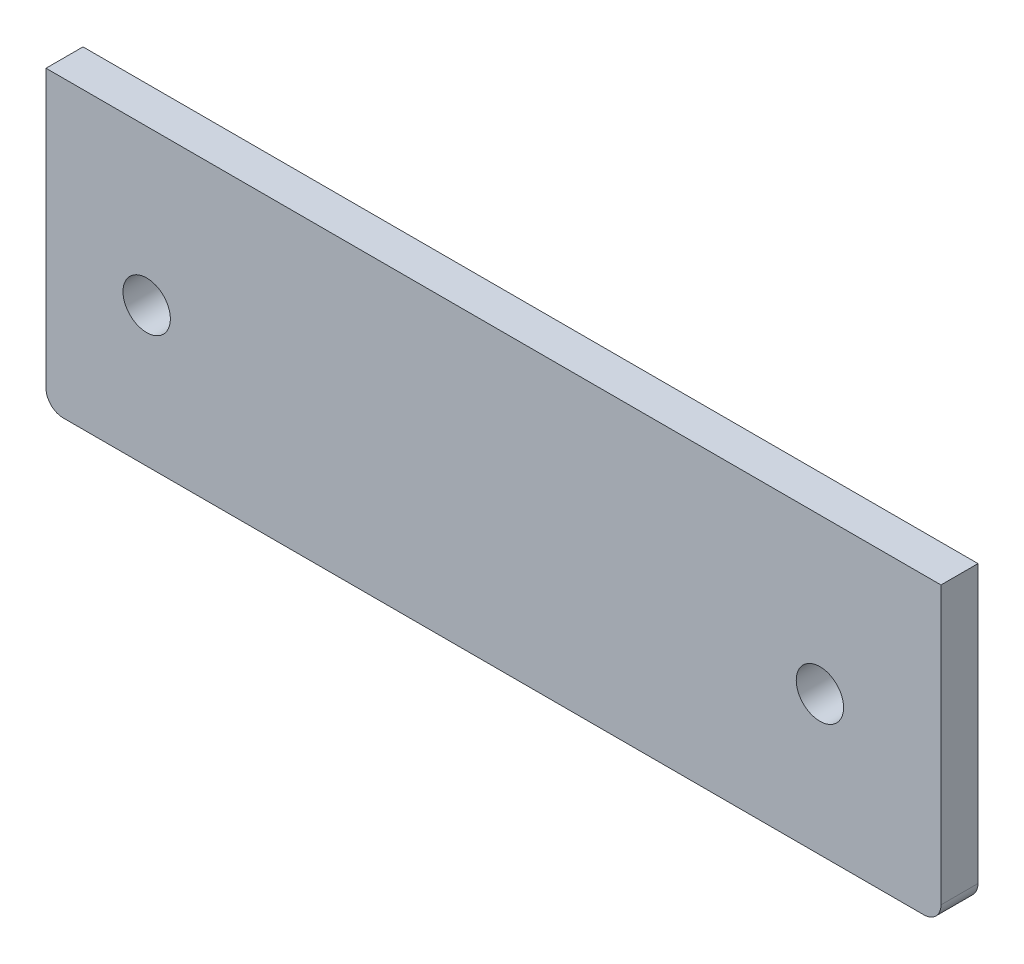
ISO-10303-21;
HEADER;
FILE_DESCRIPTION(('STEP AP214'),'2;1');
FILE_NAME('part.step','',(''),(''),'','','');
FILE_SCHEMA(('AUTOMOTIVE_DESIGN { 1 0 10303 214 1 1 1 1 }'));
ENDSEC;
DATA;
#1=APPLICATION_CONTEXT('core data for automotive mechanical design processes');
#2=APPLICATION_PROTOCOL_DEFINITION('international standard','automotive_design',2000,#1);
#3=PRODUCT_CONTEXT('',#1,'mechanical');
#4=PRODUCT('Part','Part','',(#3));
#5=PRODUCT_RELATED_PRODUCT_CATEGORY('part','',(#4));
#6=PRODUCT_DEFINITION_FORMATION('','',#4);
#7=PRODUCT_DEFINITION_CONTEXT('part definition',#1,'design');
#8=PRODUCT_DEFINITION('design','',#6,#7);
#9=PRODUCT_DEFINITION_SHAPE('','',#8);
#10=(LENGTH_UNIT() NAMED_UNIT(*) SI_UNIT(.MILLI.,.METRE.));
#11=(NAMED_UNIT(*) PLANE_ANGLE_UNIT() SI_UNIT($,.RADIAN.));
#12=(NAMED_UNIT(*) SI_UNIT($,.STERADIAN.) SOLID_ANGLE_UNIT());
#13=UNCERTAINTY_MEASURE_WITH_UNIT(LENGTH_MEASURE(1.E-05),#10,'distance_accuracy_value','');
#14=(GEOMETRIC_REPRESENTATION_CONTEXT(3) GLOBAL_UNCERTAINTY_ASSIGNED_CONTEXT((#13)) GLOBAL_UNIT_ASSIGNED_CONTEXT((#10,
#11,#12)) REPRESENTATION_CONTEXT('',''));
#15=CARTESIAN_POINT('',(0.,0.,0.));
#16=DIRECTION('',(0.,0.,1.));
#17=DIRECTION('',(1.,0.,0.));
#18=AXIS2_PLACEMENT_3D('',#15,#16,#17);
#19=CARTESIAN_POINT('',(0.,0.,23.6));
#20=DIRECTION('',(0.,0.,1.));
#21=DIRECTION('',(1.,0.,0.));
#22=AXIS2_PLACEMENT_3D('',#19,#20,#21);
#23=PLANE('',#22);
#24=CARTESIAN_POINT('',(-57.7823194312308,1.49846116090471,23.6));
#25=DIRECTION('',(0.,0.,1.));
#26=DIRECTION('',(1.,0.,0.));
#27=AXIS2_PLACEMENT_3D('',#24,#25,#26);
#28=CIRCLE('',#27,2.74999999999999);
#29=CARTESIAN_POINT('',(-60.5323194312308,1.49846116090471,23.6));
#30=VERTEX_POINT('',#29);
#31=EDGE_CURVE('E117',#30,#30,#28,.T.);
#32=ORIENTED_EDGE('',*,*,#31,.F.);
#33=EDGE_LOOP('',(#32));
#34=FACE_BOUND('',#33,.T.);
#35=DIRECTION('',(1.,0.,0.));
#36=VECTOR('',#35,1.);
#37=CARTESIAN_POINT('',(-69.4767741901678,-14.6898747964315,23.6));
#38=LINE('',#37,#36);
#39=CARTESIAN_POINT('',(-67.4767741901678,-14.6898747964315,23.6));
#40=VERTEX_POINT('',#39);
#41=CARTESIAN_POINT('',(32.4916365637999,-14.6898747964315,23.6));
#42=VERTEX_POINT('',#41);
#43=EDGE_CURVE('E96',#40,#42,#38,.T.);
#44=ORIENTED_EDGE('',*,*,#43,.T.);
#45=CARTESIAN_POINT('',(32.4916365637999,-12.6898747964315,23.6));
#46=DIRECTION('',(0.,0.,1.));
#47=DIRECTION('',(1.,0.,0.));
#48=AXIS2_PLACEMENT_3D('',#45,#46,#47);
#49=CIRCLE('',#48,2.);
#50=CARTESIAN_POINT('',(34.4916365637999,-12.6898747964315,23.6));
#51=VERTEX_POINT('',#50);
#52=EDGE_CURVE('E40',#42,#51,#49,.T.);
#53=ORIENTED_EDGE('',*,*,#52,.T.);
#54=DIRECTION('',(0.,1.,0.));
#55=VECTOR('',#54,1.);
#56=CARTESIAN_POINT('',(34.4916365637999,-14.6898747964315,23.6));
#57=LINE('',#56,#55);
#58=CARTESIAN_POINT('',(34.4916365637999,19.4961837580603,23.6));
#59=VERTEX_POINT('',#58);
#60=EDGE_CURVE('E86',#51,#59,#57,.T.);
#61=ORIENTED_EDGE('',*,*,#60,.T.);
#62=DIRECTION('',(-1.,0.,0.));
#63=VECTOR('',#62,1.);
#64=CARTESIAN_POINT('',(34.4916365637999,19.4961837580603,23.6));
#65=LINE('',#64,#63);
#66=CARTESIAN_POINT('',(-69.4767741901678,19.4961837580603,23.6));
#67=VERTEX_POINT('',#66);
#68=EDGE_CURVE('E90',#59,#67,#65,.T.);
#69=ORIENTED_EDGE('',*,*,#68,.T.);
#70=DIRECTION('',(0.,-1.,0.));
#71=VECTOR('',#70,1.);
#72=CARTESIAN_POINT('',(-69.4767741901678,19.4961837580603,23.6));
#73=LINE('',#72,#71);
#74=CARTESIAN_POINT('',(-69.4767741901678,-12.6898747964315,23.6));
#75=VERTEX_POINT('',#74);
#76=EDGE_CURVE('E121',#67,#75,#73,.T.);
#77=ORIENTED_EDGE('',*,*,#76,.T.);
#78=CARTESIAN_POINT('',(-67.4767741901678,-12.6898747964315,23.6));
#79=DIRECTION('',(0.,0.,1.));
#80=DIRECTION('',(1.,0.,0.));
#81=AXIS2_PLACEMENT_3D('',#78,#79,#80);
#82=CIRCLE('',#81,2.);
#83=EDGE_CURVE('E132',#75,#40,#82,.T.);
#84=ORIENTED_EDGE('',*,*,#83,.T.);
#85=EDGE_LOOP('',(#44,#53,#61,#69,#77,#84));
#86=FACE_BOUND('',#85,.T.);
#87=CARTESIAN_POINT('',(20.4264892959067,1.49846116090477,23.6));
#88=DIRECTION('',(0.,0.,1.));
#89=DIRECTION('',(1.,0.,0.));
#90=AXIS2_PLACEMENT_3D('',#87,#88,#89);
#91=CIRCLE('',#90,2.74999999999999);
#92=CARTESIAN_POINT('',(17.6764892959067,1.49846116090477,23.6));
#93=VERTEX_POINT('',#92);
#94=EDGE_CURVE('E148',#93,#93,#91,.T.);
#95=ORIENTED_EDGE('',*,*,#94,.F.);
#96=EDGE_LOOP('',(#95));
#97=FACE_BOUND('',#96,.T.);
#98=ADVANCED_FACE('F32',(#34,#86,#97),#23,.T.);
#99=CARTESIAN_POINT('',(0.,0.,19.3));
#100=DIRECTION('',(0.,0.,1.));
#101=DIRECTION('',(1.,0.,0.));
#102=AXIS2_PLACEMENT_3D('',#99,#100,#101);
#103=PLANE('',#102);
#104=DIRECTION('',(0.,1.,0.));
#105=VECTOR('',#104,1.);
#106=CARTESIAN_POINT('',(34.4916365637999,-14.6898747964315,19.3));
#107=LINE('',#106,#105);
#108=CARTESIAN_POINT('',(34.4916365637999,-12.6898747964315,19.3));
#109=VERTEX_POINT('',#108);
#110=CARTESIAN_POINT('',(34.4916365637999,19.4961837580603,19.3));
#111=VERTEX_POINT('',#110);
#112=EDGE_CURVE('E102',#109,#111,#107,.T.);
#113=ORIENTED_EDGE('',*,*,#112,.F.);
#114=CARTESIAN_POINT('',(32.4916365637999,-12.6898747964315,19.3));
#115=DIRECTION('',(0.,0.,1.));
#116=DIRECTION('',(1.,0.,0.));
#117=AXIS2_PLACEMENT_3D('',#114,#115,#116);
#118=CIRCLE('',#117,2.);
#119=CARTESIAN_POINT('',(32.4916365637999,-14.6898747964315,19.3));
#120=VERTEX_POINT('',#119);
#121=EDGE_CURVE('E126',#109,#120,#118,.F.);
#122=ORIENTED_EDGE('',*,*,#121,.T.);
#123=DIRECTION('',(1.,0.,0.));
#124=VECTOR('',#123,1.);
#125=CARTESIAN_POINT('',(-69.4767741901678,-14.6898747964315,19.3));
#126=LINE('',#125,#124);
#127=CARTESIAN_POINT('',(-67.4767741901678,-14.6898747964315,19.3));
#128=VERTEX_POINT('',#127);
#129=EDGE_CURVE('E116',#128,#120,#126,.T.);
#130=ORIENTED_EDGE('',*,*,#129,.F.);
#131=CARTESIAN_POINT('',(-67.4767741901678,-12.6898747964315,19.3));
#132=DIRECTION('',(0.,0.,1.));
#133=DIRECTION('',(1.,0.,0.));
#134=AXIS2_PLACEMENT_3D('',#131,#132,#133);
#135=CIRCLE('',#134,2.);
#136=CARTESIAN_POINT('',(-69.4767741901678,-12.6898747964315,19.3));
#137=VERTEX_POINT('',#136);
#138=EDGE_CURVE('E124',#128,#137,#135,.F.);
#139=ORIENTED_EDGE('',*,*,#138,.T.);
#140=DIRECTION('',(0.,-1.,0.));
#141=VECTOR('',#140,1.);
#142=CARTESIAN_POINT('',(-69.4767741901678,19.4961837580603,19.3));
#143=LINE('',#142,#141);
#144=CARTESIAN_POINT('',(-69.4767741901678,19.4961837580603,19.3));
#145=VERTEX_POINT('',#144);
#146=EDGE_CURVE('E114',#145,#137,#143,.T.);
#147=ORIENTED_EDGE('',*,*,#146,.F.);
#148=DIRECTION('',(-1.,0.,0.));
#149=VECTOR('',#148,1.);
#150=CARTESIAN_POINT('',(34.4916365637999,19.4961837580603,19.3));
#151=LINE('',#150,#149);
#152=EDGE_CURVE('E120',#111,#145,#151,.T.);
#153=ORIENTED_EDGE('',*,*,#152,.F.);
#154=EDGE_LOOP('',(#113,#122,#130,#139,#147,#153));
#155=FACE_BOUND('',#154,.T.);
#156=CARTESIAN_POINT('',(-57.7823194312308,1.49846116090471,19.3));
#157=DIRECTION('',(0.,0.,1.));
#158=DIRECTION('',(1.,0.,0.));
#159=AXIS2_PLACEMENT_3D('',#156,#157,#158);
#160=CIRCLE('',#159,2.74999999999999);
#161=CARTESIAN_POINT('',(-60.5323194312308,1.49846116090471,19.3));
#162=VERTEX_POINT('',#161);
#163=EDGE_CURVE('E145',#162,#162,#160,.T.);
#164=ORIENTED_EDGE('',*,*,#163,.T.);
#165=EDGE_LOOP('',(#164));
#166=FACE_BOUND('',#165,.T.);
#167=CARTESIAN_POINT('',(20.4264892959067,1.49846116090477,19.3));
#168=DIRECTION('',(0.,0.,1.));
#169=DIRECTION('',(1.,0.,0.));
#170=AXIS2_PLACEMENT_3D('',#167,#168,#169);
#171=CIRCLE('',#170,2.74999999999999);
#172=CARTESIAN_POINT('',(17.6764892959067,1.49846116090477,19.3));
#173=VERTEX_POINT('',#172);
#174=EDGE_CURVE('E151',#173,#173,#171,.T.);
#175=ORIENTED_EDGE('',*,*,#174,.T.);
#176=EDGE_LOOP('',(#175));
#177=FACE_BOUND('',#176,.T.);
#178=ADVANCED_FACE('F140',(#155,#166,#177),#103,.F.);
#179=CARTESIAN_POINT('',(-69.4767741901678,19.4961837580603,23.6));
#180=DIRECTION('',(1.,0.,0.));
#181=DIRECTION('',(0.,0.,-1.));
#182=AXIS2_PLACEMENT_3D('',#179,#180,#181);
#183=PLANE('',#182);
#184=ORIENTED_EDGE('',*,*,#146,.T.);
#185=DIRECTION('',(0.,0.,-1.));
#186=VECTOR('',#185,1.);
#187=CARTESIAN_POINT('',(-69.4767741901678,-12.6898747964315,23.6));
#188=LINE('',#187,#186);
#189=EDGE_CURVE('E11',#137,#75,#188,.F.);
#190=ORIENTED_EDGE('',*,*,#189,.T.);
#191=ORIENTED_EDGE('',*,*,#76,.F.);
#192=DIRECTION('',(0.,0.,-1.));
#193=VECTOR('',#192,1.);
#194=CARTESIAN_POINT('',(-69.4767741901678,19.4961837580603,23.6));
#195=LINE('',#194,#193);
#196=EDGE_CURVE('E106',#67,#145,#195,.T.);
#197=ORIENTED_EDGE('',*,*,#196,.T.);
#198=EDGE_LOOP('',(#184,#190,#191,#197));
#199=FACE_BOUND('',#198,.T.);
#200=ADVANCED_FACE('F142',(#199),#183,.F.);
#201=CARTESIAN_POINT('',(-69.4767741901678,-14.6898747964315,23.6));
#202=DIRECTION('',(0.,1.,0.));
#203=DIRECTION('',(0.,0.,1.));
#204=AXIS2_PLACEMENT_3D('',#201,#202,#203);
#205=PLANE('',#204);
#206=ORIENTED_EDGE('',*,*,#129,.T.);
#207=DIRECTION('',(0.,0.,-1.));
#208=VECTOR('',#207,1.);
#209=CARTESIAN_POINT('',(32.4916365637999,-14.6898747964315,23.6));
#210=LINE('',#209,#208);
#211=EDGE_CURVE('E53',#120,#42,#210,.F.);
#212=ORIENTED_EDGE('',*,*,#211,.T.);
#213=ORIENTED_EDGE('',*,*,#43,.F.);
#214=DIRECTION('',(0.,0.,-1.));
#215=VECTOR('',#214,1.);
#216=CARTESIAN_POINT('',(-67.4767741901678,-14.6898747964315,23.6));
#217=LINE('',#216,#215);
#218=EDGE_CURVE('E128',#40,#128,#217,.T.);
#219=ORIENTED_EDGE('',*,*,#218,.T.);
#220=EDGE_LOOP('',(#206,#212,#213,#219));
#221=FACE_BOUND('',#220,.T.);
#222=ADVANCED_FACE('F136',(#221),#205,.F.);
#223=CARTESIAN_POINT('',(34.4916365637999,-14.6898747964315,23.6));
#224=DIRECTION('',(-1.,0.,0.));
#225=DIRECTION('',(0.,0.,1.));
#226=AXIS2_PLACEMENT_3D('',#223,#224,#225);
#227=PLANE('',#226);
#228=ORIENTED_EDGE('',*,*,#60,.F.);
#229=DIRECTION('',(0.,0.,-1.));
#230=VECTOR('',#229,1.);
#231=CARTESIAN_POINT('',(34.4916365637999,-12.6898747964315,23.6));
#232=LINE('',#231,#230);
#233=EDGE_CURVE('E105',#51,#109,#232,.T.);
#234=ORIENTED_EDGE('',*,*,#233,.T.);
#235=ORIENTED_EDGE('',*,*,#112,.T.);
#236=DIRECTION('',(0.,0.,-1.));
#237=VECTOR('',#236,1.);
#238=CARTESIAN_POINT('',(34.4916365637999,19.4961837580603,23.6));
#239=LINE('',#238,#237);
#240=EDGE_CURVE('E99',#59,#111,#239,.T.);
#241=ORIENTED_EDGE('',*,*,#240,.F.);
#242=EDGE_LOOP('',(#228,#234,#235,#241));
#243=FACE_BOUND('',#242,.T.);
#244=ADVANCED_FACE('F100',(#243),#227,.F.);
#245=CARTESIAN_POINT('',(34.4916365637999,19.4961837580603,23.6));
#246=DIRECTION('',(0.,-1.,0.));
#247=DIRECTION('',(0.,0.,-1.));
#248=AXIS2_PLACEMENT_3D('',#245,#246,#247);
#249=PLANE('',#248);
#250=ORIENTED_EDGE('',*,*,#152,.T.);
#251=ORIENTED_EDGE('',*,*,#196,.F.);
#252=ORIENTED_EDGE('',*,*,#68,.F.);
#253=ORIENTED_EDGE('',*,*,#240,.T.);
#254=EDGE_LOOP('',(#250,#251,#252,#253));
#255=FACE_BOUND('',#254,.T.);
#256=ADVANCED_FACE('F108',(#255),#249,.F.);
#257=CARTESIAN_POINT('',(-57.7823194312308,1.49846116090471,23.6));
#258=DIRECTION('',(0.,0.,-1.));
#259=DIRECTION('',(-1.,0.,0.));
#260=AXIS2_PLACEMENT_3D('',#257,#258,#259);
#261=CYLINDRICAL_SURFACE('',#260,2.74999999999999);
#262=CARTESIAN_POINT('',(-60.5323194312308,1.49846116090471,23.6));
#263=CARTESIAN_POINT('',(-60.5323194312308,1.49846116090471,23.5552083333333));
#264=CARTESIAN_POINT('',(-60.5323194312308,1.49846116090471,23.5104166666667));
#265=CARTESIAN_POINT('',(-60.5323194312308,1.49846116090471,23.4208333333333));
#266=CARTESIAN_POINT('',(-60.5323194312308,1.49846116090471,23.3760416666667));
#267=CARTESIAN_POINT('',(-60.5323194312308,1.49846116090471,23.2864583333333));
#268=CARTESIAN_POINT('',(-60.5323194312308,1.49846116090471,23.2416666666667));
#269=CARTESIAN_POINT('',(-60.5323194312308,1.49846116090471,23.1520833333333));
#270=CARTESIAN_POINT('',(-60.5323194312308,1.49846116090471,23.1072916666667));
#271=CARTESIAN_POINT('',(-60.5323194312308,1.49846116090471,23.0177083333333));
#272=CARTESIAN_POINT('',(-60.5323194312308,1.49846116090471,22.9729166666667));
#273=CARTESIAN_POINT('',(-60.5323194312308,1.49846116090471,22.8833333333333));
#274=CARTESIAN_POINT('',(-60.5323194312308,1.49846116090471,22.8385416666667));
#275=CARTESIAN_POINT('',(-60.5323194312308,1.49846116090471,22.7489583333333));
#276=CARTESIAN_POINT('',(-60.5323194312308,1.49846116090471,22.7041666666667));
#277=CARTESIAN_POINT('',(-60.5323194312308,1.49846116090471,22.6145833333333));
#278=CARTESIAN_POINT('',(-60.5323194312308,1.49846116090471,22.5697916666667));
#279=CARTESIAN_POINT('',(-60.5323194312308,1.49846116090471,22.4802083333333));
#280=CARTESIAN_POINT('',(-60.5323194312308,1.49846116090471,22.4354166666667));
#281=CARTESIAN_POINT('',(-60.5323194312308,1.49846116090471,22.3458333333333));
#282=CARTESIAN_POINT('',(-60.5323194312308,1.49846116090471,22.3010416666667));
#283=CARTESIAN_POINT('',(-60.5323194312308,1.49846116090471,22.2114583333333));
#284=CARTESIAN_POINT('',(-60.5323194312308,1.49846116090471,22.1666666666667));
#285=CARTESIAN_POINT('',(-60.5323194312308,1.49846116090471,22.0770833333333));
#286=CARTESIAN_POINT('',(-60.5323194312308,1.49846116090471,22.0322916666667));
#287=CARTESIAN_POINT('',(-60.5323194312308,1.49846116090471,21.9427083333333));
#288=CARTESIAN_POINT('',(-60.5323194312308,1.49846116090471,21.8979166666667));
#289=CARTESIAN_POINT('',(-60.5323194312308,1.49846116090471,21.8083333333333));
#290=CARTESIAN_POINT('',(-60.5323194312308,1.49846116090471,21.7635416666667));
#291=CARTESIAN_POINT('',(-60.5323194312308,1.49846116090471,21.6739583333333));
#292=CARTESIAN_POINT('',(-60.5323194312308,1.49846116090471,21.6291666666667));
#293=CARTESIAN_POINT('',(-60.5323194312308,1.49846116090471,21.5395833333333));
#294=CARTESIAN_POINT('',(-60.5323194312308,1.49846116090471,21.4947916666667));
#295=CARTESIAN_POINT('',(-60.5323194312308,1.49846116090471,21.4052083333333));
#296=CARTESIAN_POINT('',(-60.5323194312308,1.49846116090471,21.3604166666667));
#297=CARTESIAN_POINT('',(-60.5323194312308,1.49846116090471,21.2708333333333));
#298=CARTESIAN_POINT('',(-60.5323194312308,1.49846116090471,21.2260416666667));
#299=CARTESIAN_POINT('',(-60.5323194312308,1.49846116090471,21.1364583333333));
#300=CARTESIAN_POINT('',(-60.5323194312308,1.49846116090471,21.0916666666667));
#301=CARTESIAN_POINT('',(-60.5323194312308,1.49846116090471,21.0020833333333));
#302=CARTESIAN_POINT('',(-60.5323194312308,1.49846116090471,20.9572916666667));
#303=CARTESIAN_POINT('',(-60.5323194312308,1.49846116090471,20.8677083333333));
#304=CARTESIAN_POINT('',(-60.5323194312308,1.49846116090471,20.8229166666667));
#305=CARTESIAN_POINT('',(-60.5323194312308,1.49846116090471,20.7333333333333));
#306=CARTESIAN_POINT('',(-60.5323194312308,1.49846116090471,20.6885416666667));
#307=CARTESIAN_POINT('',(-60.5323194312308,1.49846116090471,20.5989583333333));
#308=CARTESIAN_POINT('',(-60.5323194312308,1.49846116090471,20.5541666666667));
#309=CARTESIAN_POINT('',(-60.5323194312308,1.49846116090471,20.4645833333333));
#310=CARTESIAN_POINT('',(-60.5323194312308,1.49846116090471,20.4197916666667));
#311=CARTESIAN_POINT('',(-60.5323194312308,1.49846116090471,20.3302083333333));
#312=CARTESIAN_POINT('',(-60.5323194312308,1.49846116090471,20.2854166666667));
#313=CARTESIAN_POINT('',(-60.5323194312308,1.49846116090471,20.1958333333333));
#314=CARTESIAN_POINT('',(-60.5323194312308,1.49846116090471,20.1510416666667));
#315=CARTESIAN_POINT('',(-60.5323194312308,1.49846116090471,20.0614583333333));
#316=CARTESIAN_POINT('',(-60.5323194312308,1.49846116090471,20.0166666666667));
#317=CARTESIAN_POINT('',(-60.5323194312308,1.49846116090471,19.9270833333333));
#318=CARTESIAN_POINT('',(-60.5323194312308,1.49846116090471,19.8822916666667));
#319=CARTESIAN_POINT('',(-60.5323194312308,1.49846116090471,19.7927083333333));
#320=CARTESIAN_POINT('',(-60.5323194312308,1.49846116090471,19.7479166666667));
#321=CARTESIAN_POINT('',(-60.5323194312308,1.49846116090471,19.6583333333333));
#322=CARTESIAN_POINT('',(-60.5323194312308,1.49846116090471,19.6135416666667));
#323=CARTESIAN_POINT('',(-60.5323194312308,1.49846116090471,19.5239583333333));
#324=CARTESIAN_POINT('',(-60.5323194312308,1.49846116090471,19.4791666666667));
#325=CARTESIAN_POINT('',(-60.5323194312308,1.49846116090471,19.3895833333333));
#326=CARTESIAN_POINT('',(-60.5323194312308,1.49846116090471,19.3447916666667));
#327=CARTESIAN_POINT('',(-60.5323194312308,1.49846116090471,19.3));
#328=B_SPLINE_CURVE_WITH_KNOTS('',3,(#262,#263,#264,#265,#266,#267,#268,#269,#270,#271,#272,
#273,#274,#275,#276,#277,#278,#279,#280,#281,#282,#283,#284,#285,#286,#287,#288,#289,#290,#291,
#292,#293,#294,#295,#296,#297,#298,#299,#300,#301,#302,#303,#304,#305,#306,#307,#308,#309,#310,
#311,#312,#313,#314,#315,#316,#317,#318,#319,#320,#321,#322,#323,#324,#325,#326,#327),
.UNSPECIFIED.,.F.,.F.,(4,2,2,2,2,2,2,2,2,2,2,2,2,2,2,2,2,2,2,2,2,2,2,2,2,2,2,2,2,2,2,2,4),(0.,
0.134375000000003,0.268750000000002,0.403125000000001,0.537500000000003,0.671875000000002,
0.806250000000001,0.940625,1.075,1.209375,1.34375,1.478125,1.6125,1.746875,1.88125,2.015625,
2.15,2.284375,2.41875,2.553125,2.6875,2.821875,2.95625,3.090625,3.225,3.359375,3.49375,3.628125,
3.7625,3.896875,4.03125,4.165625,4.3),.UNSPECIFIED.);
#329=EDGE_CURVE('BSEAM168',#30,#162,#328,.T.);
#330=ORIENTED_EDGE('',*,*,#31,.T.);
#331=ORIENTED_EDGE('',*,*,#163,.F.);
#332=ORIENTED_EDGE('',*,*,#329,.T.);
#333=ORIENTED_EDGE('',*,*,#329,.F.);
#334=EDGE_LOOP('',(#330,#332,#331,#333));
#335=FACE_BOUND('',#334,.T.);
#336=ADVANCED_FACE('F168',(#335),#261,.F.);
#337=CARTESIAN_POINT('',(20.4264892959067,1.49846116090477,23.6));
#338=DIRECTION('',(0.,0.,-1.));
#339=DIRECTION('',(-1.,0.,0.));
#340=AXIS2_PLACEMENT_3D('',#337,#338,#339);
#341=CYLINDRICAL_SURFACE('',#340,2.74999999999999);
#342=CARTESIAN_POINT('',(17.6764892959067,1.49846116090477,23.6));
#343=CARTESIAN_POINT('',(17.6764892959067,1.49846116090477,23.5552083333333));
#344=CARTESIAN_POINT('',(17.6764892959067,1.49846116090477,23.5104166666667));
#345=CARTESIAN_POINT('',(17.6764892959067,1.49846116090477,23.4208333333333));
#346=CARTESIAN_POINT('',(17.6764892959067,1.49846116090477,23.3760416666667));
#347=CARTESIAN_POINT('',(17.6764892959067,1.49846116090477,23.2864583333333));
#348=CARTESIAN_POINT('',(17.6764892959067,1.49846116090477,23.2416666666667));
#349=CARTESIAN_POINT('',(17.6764892959067,1.49846116090477,23.1520833333333));
#350=CARTESIAN_POINT('',(17.6764892959067,1.49846116090477,23.1072916666667));
#351=CARTESIAN_POINT('',(17.6764892959067,1.49846116090477,23.0177083333333));
#352=CARTESIAN_POINT('',(17.6764892959067,1.49846116090477,22.9729166666667));
#353=CARTESIAN_POINT('',(17.6764892959067,1.49846116090477,22.8833333333333));
#354=CARTESIAN_POINT('',(17.6764892959067,1.49846116090477,22.8385416666667));
#355=CARTESIAN_POINT('',(17.6764892959067,1.49846116090477,22.7489583333333));
#356=CARTESIAN_POINT('',(17.6764892959067,1.49846116090477,22.7041666666667));
#357=CARTESIAN_POINT('',(17.6764892959067,1.49846116090477,22.6145833333333));
#358=CARTESIAN_POINT('',(17.6764892959067,1.49846116090477,22.5697916666667));
#359=CARTESIAN_POINT('',(17.6764892959067,1.49846116090477,22.4802083333333));
#360=CARTESIAN_POINT('',(17.6764892959067,1.49846116090477,22.4354166666667));
#361=CARTESIAN_POINT('',(17.6764892959067,1.49846116090477,22.3458333333333));
#362=CARTESIAN_POINT('',(17.6764892959067,1.49846116090477,22.3010416666667));
#363=CARTESIAN_POINT('',(17.6764892959067,1.49846116090477,22.2114583333333));
#364=CARTESIAN_POINT('',(17.6764892959067,1.49846116090477,22.1666666666667));
#365=CARTESIAN_POINT('',(17.6764892959067,1.49846116090477,22.0770833333333));
#366=CARTESIAN_POINT('',(17.6764892959067,1.49846116090477,22.0322916666667));
#367=CARTESIAN_POINT('',(17.6764892959067,1.49846116090477,21.9427083333333));
#368=CARTESIAN_POINT('',(17.6764892959067,1.49846116090477,21.8979166666667));
#369=CARTESIAN_POINT('',(17.6764892959067,1.49846116090477,21.8083333333333));
#370=CARTESIAN_POINT('',(17.6764892959067,1.49846116090477,21.7635416666667));
#371=CARTESIAN_POINT('',(17.6764892959067,1.49846116090477,21.6739583333333));
#372=CARTESIAN_POINT('',(17.6764892959067,1.49846116090477,21.6291666666667));
#373=CARTESIAN_POINT('',(17.6764892959067,1.49846116090477,21.5395833333333));
#374=CARTESIAN_POINT('',(17.6764892959067,1.49846116090477,21.4947916666667));
#375=CARTESIAN_POINT('',(17.6764892959067,1.49846116090477,21.4052083333333));
#376=CARTESIAN_POINT('',(17.6764892959067,1.49846116090477,21.3604166666667));
#377=CARTESIAN_POINT('',(17.6764892959067,1.49846116090477,21.2708333333333));
#378=CARTESIAN_POINT('',(17.6764892959067,1.49846116090477,21.2260416666667));
#379=CARTESIAN_POINT('',(17.6764892959067,1.49846116090477,21.1364583333333));
#380=CARTESIAN_POINT('',(17.6764892959067,1.49846116090477,21.0916666666667));
#381=CARTESIAN_POINT('',(17.6764892959067,1.49846116090477,21.0020833333333));
#382=CARTESIAN_POINT('',(17.6764892959067,1.49846116090477,20.9572916666667));
#383=CARTESIAN_POINT('',(17.6764892959067,1.49846116090477,20.8677083333333));
#384=CARTESIAN_POINT('',(17.6764892959067,1.49846116090477,20.8229166666667));
#385=CARTESIAN_POINT('',(17.6764892959067,1.49846116090477,20.7333333333333));
#386=CARTESIAN_POINT('',(17.6764892959067,1.49846116090477,20.6885416666667));
#387=CARTESIAN_POINT('',(17.6764892959067,1.49846116090477,20.5989583333333));
#388=CARTESIAN_POINT('',(17.6764892959067,1.49846116090477,20.5541666666667));
#389=CARTESIAN_POINT('',(17.6764892959067,1.49846116090477,20.4645833333333));
#390=CARTESIAN_POINT('',(17.6764892959067,1.49846116090477,20.4197916666667));
#391=CARTESIAN_POINT('',(17.6764892959067,1.49846116090477,20.3302083333333));
#392=CARTESIAN_POINT('',(17.6764892959067,1.49846116090477,20.2854166666667));
#393=CARTESIAN_POINT('',(17.6764892959067,1.49846116090477,20.1958333333333));
#394=CARTESIAN_POINT('',(17.6764892959067,1.49846116090477,20.1510416666667));
#395=CARTESIAN_POINT('',(17.6764892959067,1.49846116090477,20.0614583333333));
#396=CARTESIAN_POINT('',(17.6764892959067,1.49846116090477,20.0166666666667));
#397=CARTESIAN_POINT('',(17.6764892959067,1.49846116090477,19.9270833333333));
#398=CARTESIAN_POINT('',(17.6764892959067,1.49846116090477,19.8822916666667));
#399=CARTESIAN_POINT('',(17.6764892959067,1.49846116090477,19.7927083333333));
#400=CARTESIAN_POINT('',(17.6764892959067,1.49846116090477,19.7479166666667));
#401=CARTESIAN_POINT('',(17.6764892959067,1.49846116090477,19.6583333333333));
#402=CARTESIAN_POINT('',(17.6764892959067,1.49846116090477,19.6135416666667));
#403=CARTESIAN_POINT('',(17.6764892959067,1.49846116090477,19.5239583333333));
#404=CARTESIAN_POINT('',(17.6764892959067,1.49846116090477,19.4791666666667));
#405=CARTESIAN_POINT('',(17.6764892959067,1.49846116090477,19.3895833333333));
#406=CARTESIAN_POINT('',(17.6764892959067,1.49846116090477,19.3447916666667));
#407=CARTESIAN_POINT('',(17.6764892959067,1.49846116090477,19.3));
#408=B_SPLINE_CURVE_WITH_KNOTS('',3,(#342,#343,#344,#345,#346,#347,#348,#349,#350,#351,#352,
#353,#354,#355,#356,#357,#358,#359,#360,#361,#362,#363,#364,#365,#366,#367,#368,#369,#370,#371,
#372,#373,#374,#375,#376,#377,#378,#379,#380,#381,#382,#383,#384,#385,#386,#387,#388,#389,#390,
#391,#392,#393,#394,#395,#396,#397,#398,#399,#400,#401,#402,#403,#404,#405,#406,#407),
.UNSPECIFIED.,.F.,.F.,(4,2,2,2,2,2,2,2,2,2,2,2,2,2,2,2,2,2,2,2,2,2,2,2,2,2,2,2,2,2,2,2,4),(0.,
0.134375000000003,0.268750000000002,0.403125000000001,0.537500000000003,0.671875000000002,
0.806250000000001,0.940625,1.075,1.209375,1.34375,1.478125,1.6125,1.746875,1.88125,2.015625,
2.15,2.284375,2.41875,2.553125,2.6875,2.821875,2.95625,3.090625,3.225,3.359375,3.49375,3.628125,
3.7625,3.896875,4.03125,4.165625,4.3),.UNSPECIFIED.);
#409=EDGE_CURVE('BSEAM157',#93,#173,#408,.T.);
#410=ORIENTED_EDGE('',*,*,#94,.T.);
#411=ORIENTED_EDGE('',*,*,#174,.F.);
#412=ORIENTED_EDGE('',*,*,#409,.T.);
#413=ORIENTED_EDGE('',*,*,#409,.F.);
#414=EDGE_LOOP('',(#410,#412,#411,#413));
#415=FACE_BOUND('',#414,.T.);
#416=ADVANCED_FACE('F157',(#415),#341,.F.);
#417=CARTESIAN_POINT('',(32.4916365637999,-12.6898747964315,23.6));
#418=DIRECTION('',(0.,0.,-1.));
#419=DIRECTION('',(-1.,0.,0.));
#420=AXIS2_PLACEMENT_3D('',#417,#418,#419);
#421=CYLINDRICAL_SURFACE('',#420,2.);
#422=ORIENTED_EDGE('',*,*,#52,.F.);
#423=ORIENTED_EDGE('',*,*,#211,.F.);
#424=ORIENTED_EDGE('',*,*,#121,.F.);
#425=ORIENTED_EDGE('',*,*,#233,.F.);
#426=EDGE_LOOP('',(#422,#423,#424,#425));
#427=FACE_BOUND('',#426,.T.);
#428=ADVANCED_FACE('F178',(#427),#421,.T.);
#429=CARTESIAN_POINT('',(-67.4767741901678,-12.6898747964315,23.6));
#430=DIRECTION('',(0.,0.,-1.));
#431=DIRECTION('',(-1.,0.,0.));
#432=AXIS2_PLACEMENT_3D('',#429,#430,#431);
#433=CYLINDRICAL_SURFACE('',#432,2.);
#434=ORIENTED_EDGE('',*,*,#83,.F.);
#435=ORIENTED_EDGE('',*,*,#189,.F.);
#436=ORIENTED_EDGE('',*,*,#138,.F.);
#437=ORIENTED_EDGE('',*,*,#218,.F.);
#438=EDGE_LOOP('',(#434,#435,#436,#437));
#439=FACE_BOUND('',#438,.T.);
#440=ADVANCED_FACE('F34',(#439),#433,.T.);
#441=CLOSED_SHELL('',(#98,#178,#200,#222,#244,#256,#336,#416,#428,#440));
#442=MANIFOLD_SOLID_BREP('B2',#441);
#443=ADVANCED_BREP_SHAPE_REPRESENTATION('',(#18,#442),#14);
#444=SHAPE_DEFINITION_REPRESENTATION(#9,#443);
ENDSEC;
END-ISO-10303-21;
